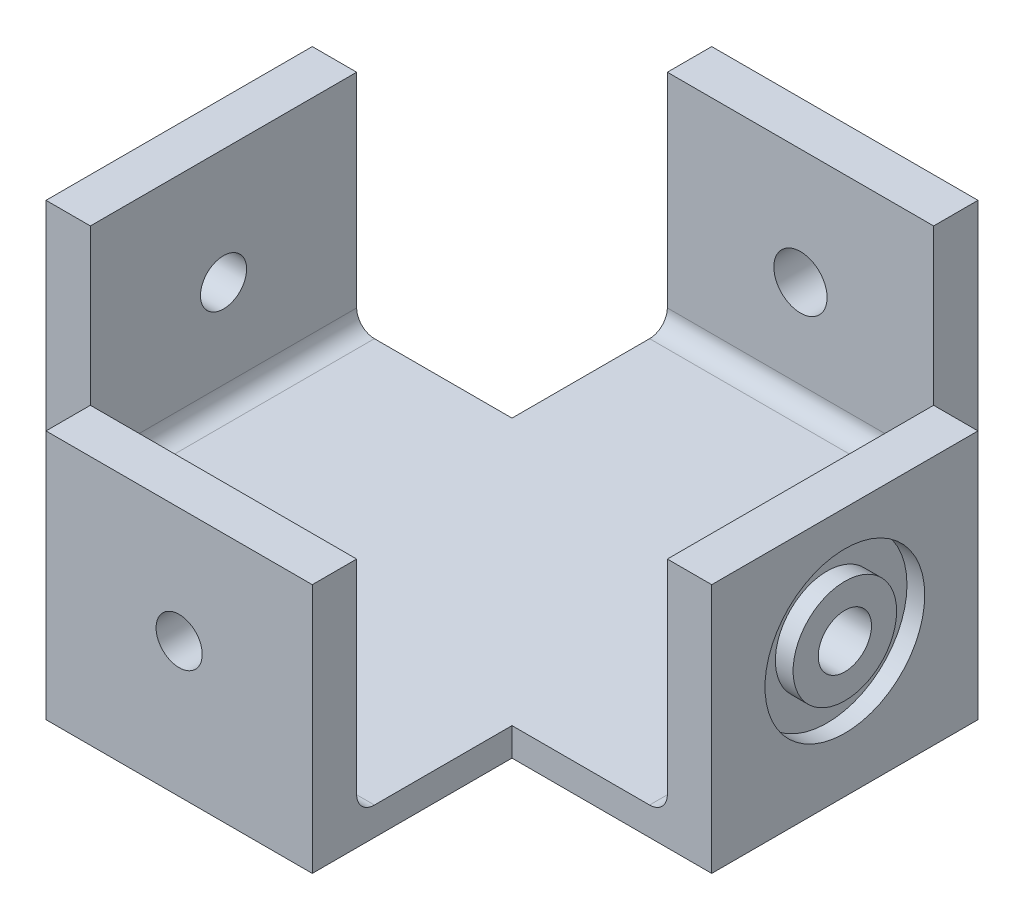
ISO-10303-21;
HEADER;
FILE_DESCRIPTION(('STEP AP214'),'2;1');
FILE_NAME('part.step','',(''),(''),'','','');
FILE_SCHEMA(('AUTOMOTIVE_DESIGN { 1 0 10303 214 1 1 1 1 }'));
ENDSEC;
DATA;
#1=APPLICATION_CONTEXT('core data for automotive mechanical design processes');
#2=APPLICATION_PROTOCOL_DEFINITION('international standard','automotive_design',2000,#1);
#3=PRODUCT_CONTEXT('',#1,'mechanical');
#4=PRODUCT('Part','Part','',(#3));
#5=PRODUCT_RELATED_PRODUCT_CATEGORY('part','',(#4));
#6=PRODUCT_DEFINITION_FORMATION('','',#4);
#7=PRODUCT_DEFINITION_CONTEXT('part definition',#1,'design');
#8=PRODUCT_DEFINITION('design','',#6,#7);
#9=PRODUCT_DEFINITION_SHAPE('','',#8);
#10=(LENGTH_UNIT() NAMED_UNIT(*) SI_UNIT(.MILLI.,.METRE.));
#11=(NAMED_UNIT(*) PLANE_ANGLE_UNIT() SI_UNIT($,.RADIAN.));
#12=(NAMED_UNIT(*) SI_UNIT($,.STERADIAN.) SOLID_ANGLE_UNIT());
#13=UNCERTAINTY_MEASURE_WITH_UNIT(LENGTH_MEASURE(1.E-05),#10,'distance_accuracy_value','');
#14=(GEOMETRIC_REPRESENTATION_CONTEXT(3) GLOBAL_UNCERTAINTY_ASSIGNED_CONTEXT((#13)) GLOBAL_UNIT_ASSIGNED_CONTEXT((#10,
#11,#12)) REPRESENTATION_CONTEXT('',''));
#15=CARTESIAN_POINT('',(0.,0.,0.));
#16=DIRECTION('',(0.,0.,1.));
#17=DIRECTION('',(1.,0.,0.));
#18=AXIS2_PLACEMENT_3D('',#15,#16,#17);
#19=CARTESIAN_POINT('',(37.5,3.175,15.));
#20=DIRECTION('',(-1.,0.,0.));
#21=DIRECTION('',(0.,0.,1.));
#22=AXIS2_PLACEMENT_3D('',#19,#20,#21);
#23=PLANE('',#22);
#24=CARTESIAN_POINT('',(37.5,15.175,0.));
#25=DIRECTION('',(1.,0.,0.));
#26=DIRECTION('',(0.,0.,-1.));
#27=AXIS2_PLACEMENT_3D('',#24,#25,#26);
#28=CIRCLE('',#27,3.);
#29=CARTESIAN_POINT('',(37.5,15.175,-3.));
#30=VERTEX_POINT('',#29);
#31=EDGE_CURVE('E396',#30,#30,#28,.T.);
#32=ORIENTED_EDGE('',*,*,#31,.F.);
#33=EDGE_LOOP('',(#32));
#34=FACE_BOUND('',#33,.T.);
#35=CARTESIAN_POINT('',(37.5,15.175,-5.06264794132254E-13));
#36=DIRECTION('',(1.,0.,0.));
#37=DIRECTION('',(0.,0.,-1.));
#38=AXIS2_PLACEMENT_3D('',#35,#36,#37);
#39=CIRCLE('',#38,5.83);
#40=CARTESIAN_POINT('',(37.4999999999999,15.175,-5.83000000000051));
#41=VERTEX_POINT('',#40);
#42=EDGE_CURVE('E428',#41,#41,#39,.T.);
#43=ORIENTED_EDGE('',*,*,#42,.T.);
#44=EDGE_LOOP('',(#43));
#45=FACE_BOUND('',#44,.T.);
#46=ADVANCED_FACE('F35',(#34,#45),#23,.F.);
#47=CARTESIAN_POINT('',(-15.,3.175,-37.5));
#48=DIRECTION('',(0.,0.,1.));
#49=DIRECTION('',(1.,0.,0.));
#50=AXIS2_PLACEMENT_3D('',#47,#48,#49);
#51=PLANE('',#50);
#52=CARTESIAN_POINT('',(-1.30930550206618E-13,15.175,-37.5));
#53=DIRECTION('',(0.,0.,-1.));
#54=DIRECTION('',(-1.,0.,0.));
#55=AXIS2_PLACEMENT_3D('',#52,#53,#54);
#56=CIRCLE('',#55,3.);
#57=CARTESIAN_POINT('',(-3.00000000000013,15.175,-37.5));
#58=VERTEX_POINT('',#57);
#59=EDGE_CURVE('E405',#58,#58,#56,.T.);
#60=ORIENTED_EDGE('',*,*,#59,.F.);
#61=EDGE_LOOP('',(#60));
#62=FACE_BOUND('',#61,.T.);
#63=CARTESIAN_POINT('',(-1.13473143512402E-13,15.175,-37.5));
#64=DIRECTION('',(0.,0.,-1.));
#65=DIRECTION('',(-1.,0.,0.));
#66=AXIS2_PLACEMENT_3D('',#63,#64,#65);
#67=CIRCLE('',#66,5.83);
#68=CARTESIAN_POINT('',(-5.83000000000011,15.175,-37.5));
#69=VERTEX_POINT('',#68);
#70=EDGE_CURVE('E416',#69,#69,#67,.T.);
#71=ORIENTED_EDGE('',*,*,#70,.T.);
#72=EDGE_LOOP('',(#71));
#73=FACE_BOUND('',#72,.T.);
#74=ADVANCED_FACE('F496',(#62,#73),#51,.F.);
#75=CARTESIAN_POINT('',(0.,3.175,0.));
#76=DIRECTION('',(0.,1.,0.));
#77=DIRECTION('',(0.,0.,1.));
#78=AXIS2_PLACEMENT_3D('',#75,#76,#77);
#79=PLANE('',#78);
#80=DIRECTION('',(0.,0.,1.));
#81=VECTOR('',#80,1.);
#82=CARTESIAN_POINT('',(-15.,3.175,37.5));
#83=LINE('',#82,#81);
#84=CARTESIAN_POINT('',(-15.,3.175,15.));
#85=VERTEX_POINT('',#84);
#86=CARTESIAN_POINT('',(-15.,3.175,30.5));
#87=VERTEX_POINT('',#86);
#88=EDGE_CURVE('E300',#85,#87,#83,.T.);
#89=ORIENTED_EDGE('',*,*,#88,.T.);
#90=DIRECTION('',(-1.,0.,0.));
#91=VECTOR('',#90,1.);
#92=CARTESIAN_POINT('',(0.,3.175,30.5));
#93=LINE('',#92,#91);
#94=CARTESIAN_POINT('',(15.,3.175,30.5));
#95=VERTEX_POINT('',#94);
#96=EDGE_CURVE('E382',#87,#95,#93,.F.);
#97=ORIENTED_EDGE('',*,*,#96,.T.);
#98=DIRECTION('',(0.,0.,-1.));
#99=VECTOR('',#98,1.);
#100=CARTESIAN_POINT('',(15.,3.175,37.5));
#101=LINE('',#100,#99);
#102=CARTESIAN_POINT('',(15.,3.175,15.));
#103=VERTEX_POINT('',#102);
#104=EDGE_CURVE('E303',#95,#103,#101,.T.);
#105=ORIENTED_EDGE('',*,*,#104,.T.);
#106=DIRECTION('',(1.,0.,0.));
#107=VECTOR('',#106,1.);
#108=CARTESIAN_POINT('',(15.,3.175,15.));
#109=LINE('',#108,#107);
#110=CARTESIAN_POINT('',(30.5,3.175,15.));
#111=VERTEX_POINT('',#110);
#112=EDGE_CURVE('E305',#103,#111,#109,.T.);
#113=ORIENTED_EDGE('',*,*,#112,.T.);
#114=DIRECTION('',(0.,0.,1.));
#115=VECTOR('',#114,1.);
#116=CARTESIAN_POINT('',(30.5,3.175,0.));
#117=LINE('',#116,#115);
#118=CARTESIAN_POINT('',(30.5,3.175,-15.));
#119=VERTEX_POINT('',#118);
#120=EDGE_CURVE('E364',#111,#119,#117,.F.);
#121=ORIENTED_EDGE('',*,*,#120,.T.);
#122=DIRECTION('',(-1.,0.,0.));
#123=VECTOR('',#122,1.);
#124=CARTESIAN_POINT('',(15.,3.175,-15.));
#125=LINE('',#124,#123);
#126=CARTESIAN_POINT('',(15.,3.175,-15.));
#127=VERTEX_POINT('',#126);
#128=EDGE_CURVE('E287',#119,#127,#125,.T.);
#129=ORIENTED_EDGE('',*,*,#128,.T.);
#130=DIRECTION('',(0.,0.,-1.));
#131=VECTOR('',#130,1.);
#132=CARTESIAN_POINT('',(15.,3.175,-15.));
#133=LINE('',#132,#131);
#134=CARTESIAN_POINT('',(15.,3.175,-30.5));
#135=VERTEX_POINT('',#134);
#136=EDGE_CURVE('E289',#127,#135,#133,.T.);
#137=ORIENTED_EDGE('',*,*,#136,.T.);
#138=DIRECTION('',(1.,0.,0.));
#139=VECTOR('',#138,1.);
#140=CARTESIAN_POINT('',(0.,3.175,-30.5));
#141=LINE('',#140,#139);
#142=CARTESIAN_POINT('',(-15.,3.175,-30.5));
#143=VERTEX_POINT('',#142);
#144=EDGE_CURVE('E380',#135,#143,#141,.F.);
#145=ORIENTED_EDGE('',*,*,#144,.T.);
#146=DIRECTION('',(0.,0.,1.));
#147=VECTOR('',#146,1.);
#148=CARTESIAN_POINT('',(-15.,3.175,-15.));
#149=LINE('',#148,#147);
#150=CARTESIAN_POINT('',(-15.,3.175,-15.));
#151=VERTEX_POINT('',#150);
#152=EDGE_CURVE('E293',#143,#151,#149,.T.);
#153=ORIENTED_EDGE('',*,*,#152,.T.);
#154=DIRECTION('',(-1.,0.,0.));
#155=VECTOR('',#154,1.);
#156=CARTESIAN_POINT('',(-37.5,3.175,-15.));
#157=LINE('',#156,#155);
#158=CARTESIAN_POINT('',(-30.5,3.175,-15.));
#159=VERTEX_POINT('',#158);
#160=EDGE_CURVE('E295',#151,#159,#157,.T.);
#161=ORIENTED_EDGE('',*,*,#160,.T.);
#162=DIRECTION('',(0.,0.,-1.));
#163=VECTOR('',#162,1.);
#164=CARTESIAN_POINT('',(-30.5,3.175,0.));
#165=LINE('',#164,#163);
#166=CARTESIAN_POINT('',(-30.5,3.175,15.));
#167=VERTEX_POINT('',#166);
#168=EDGE_CURVE('E362',#159,#167,#165,.F.);
#169=ORIENTED_EDGE('',*,*,#168,.T.);
#170=DIRECTION('',(1.,0.,0.));
#171=VECTOR('',#170,1.);
#172=CARTESIAN_POINT('',(-37.5,3.175,15.));
#173=LINE('',#172,#171);
#174=EDGE_CURVE('E298',#167,#85,#173,.T.);
#175=ORIENTED_EDGE('',*,*,#174,.T.);
#176=EDGE_LOOP('',(#89,#97,#105,#113,#121,#129,#137,#145,#153,#161,#169,#175));
#177=FACE_BOUND('',#176,.T.);
#178=ADVANCED_FACE('F501',(#177),#79,.T.);
#179=CARTESIAN_POINT('',(15.,3.175,-15.));
#180=DIRECTION('',(0.,0.,1.));
#181=DIRECTION('',(1.,0.,0.));
#182=AXIS2_PLACEMENT_3D('',#179,#180,#181);
#183=PLANE('',#182);
#184=DIRECTION('',(-1.,0.,0.));
#185=VECTOR('',#184,1.);
#186=CARTESIAN_POINT('',(15.,0.,-15.));
#187=LINE('',#186,#185);
#188=CARTESIAN_POINT('',(37.5,0.,-15.));
#189=VERTEX_POINT('',#188);
#190=CARTESIAN_POINT('',(15.,0.,-15.));
#191=VERTEX_POINT('',#190);
#192=EDGE_CURVE('E286',#189,#191,#187,.T.);
#193=ORIENTED_EDGE('',*,*,#192,.T.);
#194=DIRECTION('',(0.,-1.,0.));
#195=VECTOR('',#194,1.);
#196=CARTESIAN_POINT('',(15.,3.175,-15.));
#197=LINE('',#196,#195);
#198=EDGE_CURVE('E208',#127,#191,#197,.T.);
#199=ORIENTED_EDGE('',*,*,#198,.F.);
#200=ORIENTED_EDGE('',*,*,#128,.F.);
#201=CARTESIAN_POINT('',(30.5,5.175,-15.));
#202=DIRECTION('',(0.,0.,1.));
#203=DIRECTION('',(1.,0.,0.));
#204=AXIS2_PLACEMENT_3D('',#201,#202,#203);
#205=CIRCLE('',#204,2.);
#206=CARTESIAN_POINT('',(32.5,5.175,-15.));
#207=VERTEX_POINT('',#206);
#208=EDGE_CURVE('E371',#119,#207,#205,.T.);
#209=ORIENTED_EDGE('',*,*,#208,.T.);
#210=DIRECTION('',(0.,-1.,0.));
#211=VECTOR('',#210,1.);
#212=CARTESIAN_POINT('',(32.5,28.175,-15.));
#213=LINE('',#212,#211);
#214=CARTESIAN_POINT('',(32.5,28.175,-15.));
#215=VERTEX_POINT('',#214);
#216=EDGE_CURVE('E266',#215,#207,#213,.T.);
#217=ORIENTED_EDGE('',*,*,#216,.F.);
#218=DIRECTION('',(-1.,0.,0.));
#219=VECTOR('',#218,1.);
#220=CARTESIAN_POINT('',(37.5,28.175,-15.));
#221=LINE('',#220,#219);
#222=CARTESIAN_POINT('',(37.5,28.175,-15.));
#223=VERTEX_POINT('',#222);
#224=EDGE_CURVE('E256',#223,#215,#221,.T.);
#225=ORIENTED_EDGE('',*,*,#224,.F.);
#226=DIRECTION('',(0.,-1.,0.));
#227=VECTOR('',#226,1.);
#228=CARTESIAN_POINT('',(37.5,3.175,-15.));
#229=LINE('',#228,#227);
#230=EDGE_CURVE('E308',#223,#189,#229,.T.);
#231=ORIENTED_EDGE('',*,*,#230,.T.);
#232=EDGE_LOOP('',(#193,#199,#200,#209,#217,#225,#231));
#233=FACE_BOUND('',#232,.T.);
#234=ADVANCED_FACE('F463',(#233),#183,.F.);
#235=CARTESIAN_POINT('',(15.,3.175,-15.));
#236=DIRECTION('',(-1.,0.,0.));
#237=DIRECTION('',(0.,0.,1.));
#238=AXIS2_PLACEMENT_3D('',#235,#236,#237);
#239=PLANE('',#238);
#240=DIRECTION('',(0.,0.,-1.));
#241=VECTOR('',#240,1.);
#242=CARTESIAN_POINT('',(15.,0.,-15.));
#243=LINE('',#242,#241);
#244=CARTESIAN_POINT('',(15.,0.,-37.5));
#245=VERTEX_POINT('',#244);
#246=EDGE_CURVE('E205',#191,#245,#243,.T.);
#247=ORIENTED_EDGE('',*,*,#246,.T.);
#248=DIRECTION('',(0.,-1.,0.));
#249=VECTOR('',#248,1.);
#250=CARTESIAN_POINT('',(15.,3.175,-37.5));
#251=LINE('',#250,#249);
#252=CARTESIAN_POINT('',(15.,28.175,-37.5));
#253=VERTEX_POINT('',#252);
#254=EDGE_CURVE('E198',#253,#245,#251,.T.);
#255=ORIENTED_EDGE('',*,*,#254,.F.);
#256=DIRECTION('',(0.,0.,-1.));
#257=VECTOR('',#256,1.);
#258=CARTESIAN_POINT('',(15.,28.175,-37.5));
#259=LINE('',#258,#257);
#260=CARTESIAN_POINT('',(15.,28.175,-32.5));
#261=VERTEX_POINT('',#260);
#262=EDGE_CURVE('E203',#261,#253,#259,.T.);
#263=ORIENTED_EDGE('',*,*,#262,.F.);
#264=DIRECTION('',(0.,-1.,0.));
#265=VECTOR('',#264,1.);
#266=CARTESIAN_POINT('',(15.,28.175,-32.5));
#267=LINE('',#266,#265);
#268=CARTESIAN_POINT('',(15.,5.175,-32.5));
#269=VERTEX_POINT('',#268);
#270=EDGE_CURVE('E233',#261,#269,#267,.T.);
#271=ORIENTED_EDGE('',*,*,#270,.T.);
#272=CARTESIAN_POINT('',(15.,5.175,-30.5));
#273=DIRECTION('',(-1.,0.,0.));
#274=DIRECTION('',(0.,0.,1.));
#275=AXIS2_PLACEMENT_3D('',#272,#273,#274);
#276=CIRCLE('',#275,2.);
#277=EDGE_CURVE('E44',#269,#135,#276,.T.);
#278=ORIENTED_EDGE('',*,*,#277,.T.);
#279=ORIENTED_EDGE('',*,*,#136,.F.);
#280=ORIENTED_EDGE('',*,*,#198,.T.);
#281=EDGE_LOOP('',(#247,#255,#263,#271,#278,#279,#280));
#282=FACE_BOUND('',#281,.T.);
#283=ADVANCED_FACE('F200',(#282),#239,.F.);
#284=CARTESIAN_POINT('',(-1.13473143512402E-13,15.175,-37.5));
#285=DIRECTION('',(0.,0.,-1.));
#286=DIRECTION('',(-1.,0.,0.));
#287=AXIS2_PLACEMENT_3D('',#284,#285,#286);
#288=CIRCLE('',#287,9.);
#289=CARTESIAN_POINT('',(-9.00000000000011,15.175,-37.5));
#290=VERTEX_POINT('',#289);
#291=EDGE_CURVE('E410',#290,#290,#288,.T.);
#292=ORIENTED_EDGE('',*,*,#291,.F.);
#293=EDGE_LOOP('',(#292));
#294=FACE_BOUND('',#293,.T.);
#295=DIRECTION('',(-1.,0.,0.));
#296=VECTOR('',#295,1.);
#297=CARTESIAN_POINT('',(-15.,0.,-37.5));
#298=LINE('',#297,#296);
#299=CARTESIAN_POINT('',(-15.,0.,-37.5));
#300=VERTEX_POINT('',#299);
#301=EDGE_CURVE('E312',#245,#300,#298,.T.);
#302=ORIENTED_EDGE('',*,*,#301,.T.);
#303=DIRECTION('',(0.,-1.,0.));
#304=VECTOR('',#303,1.);
#305=CARTESIAN_POINT('',(-15.,3.175,-37.5));
#306=LINE('',#305,#304);
#307=CARTESIAN_POINT('',(-15.,28.175,-37.5));
#308=VERTEX_POINT('',#307);
#309=EDGE_CURVE('E209',#308,#300,#306,.T.);
#310=ORIENTED_EDGE('',*,*,#309,.F.);
#311=DIRECTION('',(-1.,0.,0.));
#312=VECTOR('',#311,1.);
#313=CARTESIAN_POINT('',(15.,28.175,-37.5));
#314=LINE('',#313,#312);
#315=EDGE_CURVE('E212',#253,#308,#314,.T.);
#316=ORIENTED_EDGE('',*,*,#315,.F.);
#317=ORIENTED_EDGE('',*,*,#254,.T.);
#318=EDGE_LOOP('',(#302,#310,#316,#317));
#319=FACE_BOUND('',#318,.T.);
#320=ADVANCED_FACE('F213',(#294,#319),#51,.F.);
#321=CARTESIAN_POINT('',(-15.,3.175,-15.));
#322=DIRECTION('',(1.,0.,0.));
#323=DIRECTION('',(0.,0.,-1.));
#324=AXIS2_PLACEMENT_3D('',#321,#322,#323);
#325=PLANE('',#324);
#326=DIRECTION('',(0.,0.,1.));
#327=VECTOR('',#326,1.);
#328=CARTESIAN_POINT('',(-15.,0.,-15.));
#329=LINE('',#328,#327);
#330=CARTESIAN_POINT('',(-15.,0.,-15.));
#331=VERTEX_POINT('',#330);
#332=EDGE_CURVE('E314',#300,#331,#329,.T.);
#333=ORIENTED_EDGE('',*,*,#332,.T.);
#334=DIRECTION('',(0.,-1.,0.));
#335=VECTOR('',#334,1.);
#336=CARTESIAN_POINT('',(-15.,3.175,-15.));
#337=LINE('',#336,#335);
#338=EDGE_CURVE('E354',#151,#331,#337,.T.);
#339=ORIENTED_EDGE('',*,*,#338,.F.);
#340=ORIENTED_EDGE('',*,*,#152,.F.);
#341=CARTESIAN_POINT('',(-15.,5.175,-30.5));
#342=DIRECTION('',(1.,0.,0.));
#343=DIRECTION('',(0.,0.,-1.));
#344=AXIS2_PLACEMENT_3D('',#341,#342,#343);
#345=CIRCLE('',#344,2.);
#346=CARTESIAN_POINT('',(-15.,5.175,-32.5));
#347=VERTEX_POINT('',#346);
#348=EDGE_CURVE('E11',#143,#347,#345,.T.);
#349=ORIENTED_EDGE('',*,*,#348,.T.);
#350=DIRECTION('',(0.,-1.,0.));
#351=VECTOR('',#350,1.);
#352=CARTESIAN_POINT('',(-15.,28.175,-32.5));
#353=LINE('',#352,#351);
#354=CARTESIAN_POINT('',(-15.,28.175,-32.5));
#355=VERTEX_POINT('',#354);
#356=EDGE_CURVE('E235',#355,#347,#353,.T.);
#357=ORIENTED_EDGE('',*,*,#356,.F.);
#358=DIRECTION('',(0.,0.,1.));
#359=VECTOR('',#358,1.);
#360=CARTESIAN_POINT('',(-15.,28.175,-37.5));
#361=LINE('',#360,#359);
#362=EDGE_CURVE('E217',#308,#355,#361,.T.);
#363=ORIENTED_EDGE('',*,*,#362,.F.);
#364=ORIENTED_EDGE('',*,*,#309,.T.);
#365=EDGE_LOOP('',(#333,#339,#340,#349,#357,#363,#364));
#366=FACE_BOUND('',#365,.T.);
#367=ADVANCED_FACE('F533',(#366),#325,.F.);
#368=CARTESIAN_POINT('',(-37.5,3.175,-15.));
#369=DIRECTION('',(0.,0.,1.));
#370=DIRECTION('',(1.,0.,0.));
#371=AXIS2_PLACEMENT_3D('',#368,#369,#370);
#372=PLANE('',#371);
#373=DIRECTION('',(-1.,0.,0.));
#374=VECTOR('',#373,1.);
#375=CARTESIAN_POINT('',(-37.5,0.,-15.));
#376=LINE('',#375,#374);
#377=CARTESIAN_POINT('',(-37.5,0.,-15.));
#378=VERTEX_POINT('',#377);
#379=EDGE_CURVE('E316',#331,#378,#376,.T.);
#380=ORIENTED_EDGE('',*,*,#379,.T.);
#381=DIRECTION('',(0.,-1.,0.));
#382=VECTOR('',#381,1.);
#383=CARTESIAN_POINT('',(-37.5,3.175,-15.));
#384=LINE('',#383,#382);
#385=CARTESIAN_POINT('',(-37.5,28.175,-15.));
#386=VERTEX_POINT('',#385);
#387=EDGE_CURVE('E351',#386,#378,#384,.T.);
#388=ORIENTED_EDGE('',*,*,#387,.F.);
#389=DIRECTION('',(-1.,0.,0.));
#390=VECTOR('',#389,1.);
#391=CARTESIAN_POINT('',(-37.5,28.175,-15.));
#392=LINE('',#391,#390);
#393=CARTESIAN_POINT('',(-32.5,28.175,-15.));
#394=VERTEX_POINT('',#393);
#395=EDGE_CURVE('E272',#394,#386,#392,.T.);
#396=ORIENTED_EDGE('',*,*,#395,.F.);
#397=DIRECTION('',(0.,-1.,0.));
#398=VECTOR('',#397,1.);
#399=CARTESIAN_POINT('',(-32.5,28.175,-15.));
#400=LINE('',#399,#398);
#401=CARTESIAN_POINT('',(-32.5,5.175,-15.));
#402=VERTEX_POINT('',#401);
#403=EDGE_CURVE('E283',#394,#402,#400,.T.);
#404=ORIENTED_EDGE('',*,*,#403,.T.);
#405=CARTESIAN_POINT('',(-30.5,5.175,-15.));
#406=DIRECTION('',(0.,0.,1.));
#407=DIRECTION('',(1.,0.,0.));
#408=AXIS2_PLACEMENT_3D('',#405,#406,#407);
#409=CIRCLE('',#408,2.);
#410=EDGE_CURVE('E373',#402,#159,#409,.T.);
#411=ORIENTED_EDGE('',*,*,#410,.T.);
#412=ORIENTED_EDGE('',*,*,#160,.F.);
#413=ORIENTED_EDGE('',*,*,#338,.T.);
#414=EDGE_LOOP('',(#380,#388,#396,#404,#411,#412,#413));
#415=FACE_BOUND('',#414,.T.);
#416=ADVANCED_FACE('F529',(#415),#372,.F.);
#417=CARTESIAN_POINT('',(-37.5,3.175,15.));
#418=DIRECTION('',(1.,0.,0.));
#419=DIRECTION('',(0.,0.,-1.));
#420=AXIS2_PLACEMENT_3D('',#417,#418,#419);
#421=PLANE('',#420);
#422=CARTESIAN_POINT('',(-37.5,15.175,0.));
#423=DIRECTION('',(-1.,0.,0.));
#424=DIRECTION('',(0.,0.,1.));
#425=AXIS2_PLACEMENT_3D('',#422,#423,#424);
#426=CIRCLE('',#425,2.6);
#427=CARTESIAN_POINT('',(-37.5,15.175,2.6));
#428=VERTEX_POINT('',#427);
#429=EDGE_CURVE('E226',#428,#428,#426,.T.);
#430=ORIENTED_EDGE('',*,*,#429,.F.);
#431=EDGE_LOOP('',(#430));
#432=FACE_BOUND('',#431,.T.);
#433=DIRECTION('',(0.,0.,1.));
#434=VECTOR('',#433,1.);
#435=CARTESIAN_POINT('',(-37.5,0.,15.));
#436=LINE('',#435,#434);
#437=CARTESIAN_POINT('',(-37.5,0.,15.));
#438=VERTEX_POINT('',#437);
#439=EDGE_CURVE('E318',#378,#438,#436,.T.);
#440=ORIENTED_EDGE('',*,*,#439,.T.);
#441=DIRECTION('',(0.,-1.,0.));
#442=VECTOR('',#441,1.);
#443=CARTESIAN_POINT('',(-37.5,3.175,15.));
#444=LINE('',#443,#442);
#445=CARTESIAN_POINT('',(-37.5,28.175,15.));
#446=VERTEX_POINT('',#445);
#447=EDGE_CURVE('E348',#446,#438,#444,.T.);
#448=ORIENTED_EDGE('',*,*,#447,.F.);
#449=DIRECTION('',(0.,0.,1.));
#450=VECTOR('',#449,1.);
#451=CARTESIAN_POINT('',(-37.5,28.175,15.));
#452=LINE('',#451,#450);
#453=EDGE_CURVE('E275',#386,#446,#452,.T.);
#454=ORIENTED_EDGE('',*,*,#453,.F.);
#455=ORIENTED_EDGE('',*,*,#387,.T.);
#456=EDGE_LOOP('',(#440,#448,#454,#455));
#457=FACE_BOUND('',#456,.T.);
#458=ADVANCED_FACE('F525',(#432,#457),#421,.F.);
#459=CARTESIAN_POINT('',(-37.5,3.175,15.));
#460=DIRECTION('',(0.,0.,-1.));
#461=DIRECTION('',(-1.,0.,0.));
#462=AXIS2_PLACEMENT_3D('',#459,#460,#461);
#463=PLANE('',#462);
#464=DIRECTION('',(1.,0.,0.));
#465=VECTOR('',#464,1.);
#466=CARTESIAN_POINT('',(-37.5,0.,15.));
#467=LINE('',#466,#465);
#468=CARTESIAN_POINT('',(-15.,0.,15.));
#469=VERTEX_POINT('',#468);
#470=EDGE_CURVE('E320',#438,#469,#467,.T.);
#471=ORIENTED_EDGE('',*,*,#470,.T.);
#472=DIRECTION('',(0.,-1.,0.));
#473=VECTOR('',#472,1.);
#474=CARTESIAN_POINT('',(-15.,3.175,15.));
#475=LINE('',#474,#473);
#476=EDGE_CURVE('E345',#85,#469,#475,.T.);
#477=ORIENTED_EDGE('',*,*,#476,.F.);
#478=ORIENTED_EDGE('',*,*,#174,.F.);
#479=CARTESIAN_POINT('',(-30.5,5.175,15.));
#480=DIRECTION('',(0.,0.,-1.));
#481=DIRECTION('',(-1.,0.,0.));
#482=AXIS2_PLACEMENT_3D('',#479,#480,#481);
#483=CIRCLE('',#482,2.);
#484=CARTESIAN_POINT('',(-32.5,5.175,15.));
#485=VERTEX_POINT('',#484);
#486=EDGE_CURVE('E375',#167,#485,#483,.T.);
#487=ORIENTED_EDGE('',*,*,#486,.T.);
#488=DIRECTION('',(0.,-1.,0.));
#489=VECTOR('',#488,1.);
#490=CARTESIAN_POINT('',(-32.5,28.175,15.));
#491=LINE('',#490,#489);
#492=CARTESIAN_POINT('',(-32.5,28.175,15.));
#493=VERTEX_POINT('',#492);
#494=EDGE_CURVE('E280',#493,#485,#491,.T.);
#495=ORIENTED_EDGE('',*,*,#494,.F.);
#496=DIRECTION('',(1.,0.,0.));
#497=VECTOR('',#496,1.);
#498=CARTESIAN_POINT('',(-37.5,28.175,15.));
#499=LINE('',#498,#497);
#500=EDGE_CURVE('E278',#446,#493,#499,.T.);
#501=ORIENTED_EDGE('',*,*,#500,.F.);
#502=ORIENTED_EDGE('',*,*,#447,.T.);
#503=EDGE_LOOP('',(#471,#477,#478,#487,#495,#501,#502));
#504=FACE_BOUND('',#503,.T.);
#505=ADVANCED_FACE('F521',(#504),#463,.F.);
#506=CARTESIAN_POINT('',(-15.,3.175,37.5));
#507=DIRECTION('',(1.,0.,0.));
#508=DIRECTION('',(0.,0.,-1.));
#509=AXIS2_PLACEMENT_3D('',#506,#507,#508);
#510=PLANE('',#509);
#511=DIRECTION('',(0.,0.,1.));
#512=VECTOR('',#511,1.);
#513=CARTESIAN_POINT('',(-15.,0.,37.5));
#514=LINE('',#513,#512);
#515=CARTESIAN_POINT('',(-15.,0.,37.5));
#516=VERTEX_POINT('',#515);
#517=EDGE_CURVE('E322',#469,#516,#514,.T.);
#518=ORIENTED_EDGE('',*,*,#517,.T.);
#519=DIRECTION('',(0.,-1.,0.));
#520=VECTOR('',#519,1.);
#521=CARTESIAN_POINT('',(-15.,3.175,37.5));
#522=LINE('',#521,#520);
#523=CARTESIAN_POINT('',(-15.,28.175,37.5));
#524=VERTEX_POINT('',#523);
#525=EDGE_CURVE('E342',#524,#516,#522,.T.);
#526=ORIENTED_EDGE('',*,*,#525,.F.);
#527=DIRECTION('',(0.,0.,1.));
#528=VECTOR('',#527,1.);
#529=CARTESIAN_POINT('',(-15.,28.175,37.5));
#530=LINE('',#529,#528);
#531=CARTESIAN_POINT('',(-15.,28.175,32.5));
#532=VERTEX_POINT('',#531);
#533=EDGE_CURVE('E237',#532,#524,#530,.T.);
#534=ORIENTED_EDGE('',*,*,#533,.F.);
#535=DIRECTION('',(0.,-1.,0.));
#536=VECTOR('',#535,1.);
#537=CARTESIAN_POINT('',(-15.,28.175,32.5));
#538=LINE('',#537,#536);
#539=CARTESIAN_POINT('',(-15.,5.175,32.5));
#540=VERTEX_POINT('',#539);
#541=EDGE_CURVE('E247',#532,#540,#538,.T.);
#542=ORIENTED_EDGE('',*,*,#541,.T.);
#543=CARTESIAN_POINT('',(-15.,5.175,30.5));
#544=DIRECTION('',(1.,0.,0.));
#545=DIRECTION('',(0.,0.,-1.));
#546=AXIS2_PLACEMENT_3D('',#543,#544,#545);
#547=CIRCLE('',#546,2.);
#548=EDGE_CURVE('E386',#540,#87,#547,.T.);
#549=ORIENTED_EDGE('',*,*,#548,.T.);
#550=ORIENTED_EDGE('',*,*,#88,.F.);
#551=ORIENTED_EDGE('',*,*,#476,.T.);
#552=EDGE_LOOP('',(#518,#526,#534,#542,#549,#550,#551));
#553=FACE_BOUND('',#552,.T.);
#554=ADVANCED_FACE('F517',(#553),#510,.F.);
#555=CARTESIAN_POINT('',(-15.,3.175,37.5));
#556=DIRECTION('',(0.,0.,-1.));
#557=DIRECTION('',(-1.,0.,0.));
#558=AXIS2_PLACEMENT_3D('',#555,#556,#557);
#559=PLANE('',#558);
#560=CARTESIAN_POINT('',(1.30930550206617E-13,15.175,37.5));
#561=DIRECTION('',(0.,0.,1.));
#562=DIRECTION('',(1.,0.,0.));
#563=AXIS2_PLACEMENT_3D('',#560,#561,#562);
#564=CIRCLE('',#563,2.6);
#565=CARTESIAN_POINT('',(2.60000000000013,15.175,37.5));
#566=VERTEX_POINT('',#565);
#567=EDGE_CURVE('E393',#566,#566,#564,.T.);
#568=ORIENTED_EDGE('',*,*,#567,.F.);
#569=EDGE_LOOP('',(#568));
#570=FACE_BOUND('',#569,.T.);
#571=DIRECTION('',(1.,0.,0.));
#572=VECTOR('',#571,1.);
#573=CARTESIAN_POINT('',(-15.,0.,37.5));
#574=LINE('',#573,#572);
#575=CARTESIAN_POINT('',(15.,0.,37.5));
#576=VERTEX_POINT('',#575);
#577=EDGE_CURVE('E324',#516,#576,#574,.T.);
#578=ORIENTED_EDGE('',*,*,#577,.T.);
#579=DIRECTION('',(0.,-1.,0.));
#580=VECTOR('',#579,1.);
#581=CARTESIAN_POINT('',(15.,3.175,37.5));
#582=LINE('',#581,#580);
#583=CARTESIAN_POINT('',(15.,28.175,37.5));
#584=VERTEX_POINT('',#583);
#585=EDGE_CURVE('E339',#584,#576,#582,.T.);
#586=ORIENTED_EDGE('',*,*,#585,.F.);
#587=DIRECTION('',(1.,0.,0.));
#588=VECTOR('',#587,1.);
#589=CARTESIAN_POINT('',(15.,28.175,37.5));
#590=LINE('',#589,#588);
#591=EDGE_CURVE('E240',#524,#584,#590,.T.);
#592=ORIENTED_EDGE('',*,*,#591,.F.);
#593=ORIENTED_EDGE('',*,*,#525,.T.);
#594=EDGE_LOOP('',(#578,#586,#592,#593));
#595=FACE_BOUND('',#594,.T.);
#596=ADVANCED_FACE('F513',(#570,#595),#559,.F.);
#597=CARTESIAN_POINT('',(15.,3.175,37.5));
#598=DIRECTION('',(-1.,0.,0.));
#599=DIRECTION('',(0.,0.,1.));
#600=AXIS2_PLACEMENT_3D('',#597,#598,#599);
#601=PLANE('',#600);
#602=DIRECTION('',(0.,0.,-1.));
#603=VECTOR('',#602,1.);
#604=CARTESIAN_POINT('',(15.,0.,37.5));
#605=LINE('',#604,#603);
#606=CARTESIAN_POINT('',(15.,0.,15.));
#607=VERTEX_POINT('',#606);
#608=EDGE_CURVE('E326',#576,#607,#605,.T.);
#609=ORIENTED_EDGE('',*,*,#608,.T.);
#610=DIRECTION('',(0.,-1.,0.));
#611=VECTOR('',#610,1.);
#612=CARTESIAN_POINT('',(15.,3.175,15.));
#613=LINE('',#612,#611);
#614=EDGE_CURVE('E336',#103,#607,#613,.T.);
#615=ORIENTED_EDGE('',*,*,#614,.F.);
#616=ORIENTED_EDGE('',*,*,#104,.F.);
#617=CARTESIAN_POINT('',(15.,5.175,30.5));
#618=DIRECTION('',(-1.,0.,0.));
#619=DIRECTION('',(0.,0.,1.));
#620=AXIS2_PLACEMENT_3D('',#617,#618,#619);
#621=CIRCLE('',#620,2.);
#622=CARTESIAN_POINT('',(15.,5.175,32.5));
#623=VERTEX_POINT('',#622);
#624=EDGE_CURVE('E388',#95,#623,#621,.T.);
#625=ORIENTED_EDGE('',*,*,#624,.T.);
#626=DIRECTION('',(0.,-1.,0.));
#627=VECTOR('',#626,1.);
#628=CARTESIAN_POINT('',(15.,28.175,32.5));
#629=LINE('',#628,#627);
#630=CARTESIAN_POINT('',(15.,28.175,32.5));
#631=VERTEX_POINT('',#630);
#632=EDGE_CURVE('E250',#631,#623,#629,.T.);
#633=ORIENTED_EDGE('',*,*,#632,.F.);
#634=DIRECTION('',(0.,0.,-1.));
#635=VECTOR('',#634,1.);
#636=CARTESIAN_POINT('',(15.,28.175,37.5));
#637=LINE('',#636,#635);
#638=EDGE_CURVE('E243',#584,#631,#637,.T.);
#639=ORIENTED_EDGE('',*,*,#638,.F.);
#640=ORIENTED_EDGE('',*,*,#585,.T.);
#641=EDGE_LOOP('',(#609,#615,#616,#625,#633,#639,#640));
#642=FACE_BOUND('',#641,.T.);
#643=ADVANCED_FACE('F510',(#642),#601,.F.);
#644=CARTESIAN_POINT('',(15.,3.175,15.));
#645=DIRECTION('',(0.,0.,-1.));
#646=DIRECTION('',(-1.,0.,0.));
#647=AXIS2_PLACEMENT_3D('',#644,#645,#646);
#648=PLANE('',#647);
#649=DIRECTION('',(1.,0.,0.));
#650=VECTOR('',#649,1.);
#651=CARTESIAN_POINT('',(15.,0.,15.));
#652=LINE('',#651,#650);
#653=CARTESIAN_POINT('',(37.5,0.,15.));
#654=VERTEX_POINT('',#653);
#655=EDGE_CURVE('E328',#607,#654,#652,.T.);
#656=ORIENTED_EDGE('',*,*,#655,.T.);
#657=DIRECTION('',(0.,-1.,0.));
#658=VECTOR('',#657,1.);
#659=CARTESIAN_POINT('',(37.5,3.175,15.));
#660=LINE('',#659,#658);
#661=CARTESIAN_POINT('',(37.5,28.175,15.));
#662=VERTEX_POINT('',#661);
#663=EDGE_CURVE('E333',#662,#654,#660,.T.);
#664=ORIENTED_EDGE('',*,*,#663,.F.);
#665=DIRECTION('',(1.,0.,0.));
#666=VECTOR('',#665,1.);
#667=CARTESIAN_POINT('',(37.5,28.175,15.));
#668=LINE('',#667,#666);
#669=CARTESIAN_POINT('',(32.5,28.175,15.));
#670=VERTEX_POINT('',#669);
#671=EDGE_CURVE('E260',#670,#662,#668,.T.);
#672=ORIENTED_EDGE('',*,*,#671,.F.);
#673=DIRECTION('',(0.,-1.,0.));
#674=VECTOR('',#673,1.);
#675=CARTESIAN_POINT('',(32.5,28.175,15.));
#676=LINE('',#675,#674);
#677=CARTESIAN_POINT('',(32.5,5.175,15.));
#678=VERTEX_POINT('',#677);
#679=EDGE_CURVE('E263',#670,#678,#676,.T.);
#680=ORIENTED_EDGE('',*,*,#679,.T.);
#681=CARTESIAN_POINT('',(30.5,5.175,15.));
#682=DIRECTION('',(0.,0.,-1.));
#683=DIRECTION('',(-1.,0.,0.));
#684=AXIS2_PLACEMENT_3D('',#681,#682,#683);
#685=CIRCLE('',#684,2.);
#686=EDGE_CURVE('E369',#678,#111,#685,.T.);
#687=ORIENTED_EDGE('',*,*,#686,.T.);
#688=ORIENTED_EDGE('',*,*,#112,.F.);
#689=ORIENTED_EDGE('',*,*,#614,.T.);
#690=EDGE_LOOP('',(#656,#664,#672,#680,#687,#688,#689));
#691=FACE_BOUND('',#690,.T.);
#692=ADVANCED_FACE('F454',(#691),#648,.F.);
#693=CARTESIAN_POINT('',(37.5,15.175,-5.06264794132254E-13));
#694=DIRECTION('',(1.,0.,0.));
#695=DIRECTION('',(0.,0.,-1.));
#696=AXIS2_PLACEMENT_3D('',#693,#694,#695);
#697=CIRCLE('',#696,9.);
#698=CARTESIAN_POINT('',(37.4999999999999,15.175,-9.00000000000051));
#699=VERTEX_POINT('',#698);
#700=EDGE_CURVE('E422',#699,#699,#697,.T.);
#701=ORIENTED_EDGE('',*,*,#700,.F.);
#702=EDGE_LOOP('',(#701));
#703=FACE_BOUND('',#702,.T.);
#704=DIRECTION('',(0.,0.,-1.));
#705=VECTOR('',#704,1.);
#706=CARTESIAN_POINT('',(37.5,0.,15.));
#707=LINE('',#706,#705);
#708=EDGE_CURVE('E290',#654,#189,#707,.T.);
#709=ORIENTED_EDGE('',*,*,#708,.T.);
#710=ORIENTED_EDGE('',*,*,#230,.F.);
#711=DIRECTION('',(0.,0.,-1.));
#712=VECTOR('',#711,1.);
#713=CARTESIAN_POINT('',(37.5,28.175,15.));
#714=LINE('',#713,#712);
#715=EDGE_CURVE('E253',#662,#223,#714,.T.);
#716=ORIENTED_EDGE('',*,*,#715,.F.);
#717=ORIENTED_EDGE('',*,*,#663,.T.);
#718=EDGE_LOOP('',(#709,#710,#716,#717));
#719=FACE_BOUND('',#718,.T.);
#720=ADVANCED_FACE('F450',(#703,#719),#23,.F.);
#721=CARTESIAN_POINT('',(0.,0.,0.));
#722=DIRECTION('',(0.,1.,0.));
#723=DIRECTION('',(0.,0.,1.));
#724=AXIS2_PLACEMENT_3D('',#721,#722,#723);
#725=PLANE('',#724);
#726=ORIENTED_EDGE('',*,*,#192,.F.);
#727=ORIENTED_EDGE('',*,*,#708,.F.);
#728=ORIENTED_EDGE('',*,*,#655,.F.);
#729=ORIENTED_EDGE('',*,*,#608,.F.);
#730=ORIENTED_EDGE('',*,*,#577,.F.);
#731=ORIENTED_EDGE('',*,*,#517,.F.);
#732=ORIENTED_EDGE('',*,*,#470,.F.);
#733=ORIENTED_EDGE('',*,*,#439,.F.);
#734=ORIENTED_EDGE('',*,*,#379,.F.);
#735=ORIENTED_EDGE('',*,*,#332,.F.);
#736=ORIENTED_EDGE('',*,*,#301,.F.);
#737=ORIENTED_EDGE('',*,*,#246,.F.);
#738=EDGE_LOOP('',(#726,#727,#728,#729,#730,#731,#732,#733,#734,#735,#736,#737));
#739=FACE_BOUND('',#738,.T.);
#740=ADVANCED_FACE('F453',(#739),#725,.F.);
#741=CARTESIAN_POINT('',(-32.5,28.175,15.));
#742=DIRECTION('',(-1.,0.,0.));
#743=DIRECTION('',(0.,0.,1.));
#744=AXIS2_PLACEMENT_3D('',#741,#742,#743);
#745=PLANE('',#744);
#746=CARTESIAN_POINT('',(-32.5,15.175,0.));
#747=DIRECTION('',(-1.,0.,0.));
#748=DIRECTION('',(0.,0.,1.));
#749=AXIS2_PLACEMENT_3D('',#746,#747,#748);
#750=CIRCLE('',#749,2.6);
#751=CARTESIAN_POINT('',(-32.5,15.175,2.6));
#752=VERTEX_POINT('',#751);
#753=EDGE_CURVE('E223',#752,#752,#750,.T.);
#754=ORIENTED_EDGE('',*,*,#753,.T.);
#755=EDGE_LOOP('',(#754));
#756=FACE_BOUND('',#755,.T.);
#757=ORIENTED_EDGE('',*,*,#494,.T.);
#758=DIRECTION('',(0.,0.,-1.));
#759=VECTOR('',#758,1.);
#760=CARTESIAN_POINT('',(-32.5,5.175,15.));
#761=LINE('',#760,#759);
#762=EDGE_CURVE('E366',#485,#402,#761,.T.);
#763=ORIENTED_EDGE('',*,*,#762,.T.);
#764=ORIENTED_EDGE('',*,*,#403,.F.);
#765=DIRECTION('',(0.,0.,-1.));
#766=VECTOR('',#765,1.);
#767=CARTESIAN_POINT('',(-32.5,28.175,15.));
#768=LINE('',#767,#766);
#769=EDGE_CURVE('E269',#493,#394,#768,.T.);
#770=ORIENTED_EDGE('',*,*,#769,.F.);
#771=EDGE_LOOP('',(#757,#763,#764,#770));
#772=FACE_BOUND('',#771,.T.);
#773=ADVANCED_FACE('F594',(#756,#772),#745,.F.);
#774=CARTESIAN_POINT('',(0.,28.175,0.));
#775=DIRECTION('',(0.,-1.,0.));
#776=DIRECTION('',(0.,0.,-1.));
#777=AXIS2_PLACEMENT_3D('',#774,#775,#776);
#778=PLANE('',#777);
#779=ORIENTED_EDGE('',*,*,#769,.T.);
#780=ORIENTED_EDGE('',*,*,#395,.T.);
#781=ORIENTED_EDGE('',*,*,#453,.T.);
#782=ORIENTED_EDGE('',*,*,#500,.T.);
#783=EDGE_LOOP('',(#779,#780,#781,#782));
#784=FACE_BOUND('',#783,.T.);
#785=ADVANCED_FACE('F492',(#784),#778,.F.);
#786=CARTESIAN_POINT('',(32.5,28.175,15.));
#787=DIRECTION('',(1.,0.,0.));
#788=DIRECTION('',(0.,0.,-1.));
#789=AXIS2_PLACEMENT_3D('',#786,#787,#788);
#790=PLANE('',#789);
#791=CARTESIAN_POINT('',(32.5,15.175,0.));
#792=DIRECTION('',(1.,0.,0.));
#793=DIRECTION('',(0.,0.,-1.));
#794=AXIS2_PLACEMENT_3D('',#791,#792,#793);
#795=CIRCLE('',#794,3.);
#796=CARTESIAN_POINT('',(32.5,15.175,-3.));
#797=VERTEX_POINT('',#796);
#798=EDGE_CURVE('E394',#797,#797,#795,.T.);
#799=ORIENTED_EDGE('',*,*,#798,.T.);
#800=EDGE_LOOP('',(#799));
#801=FACE_BOUND('',#800,.T.);
#802=ORIENTED_EDGE('',*,*,#216,.T.);
#803=DIRECTION('',(0.,0.,1.));
#804=VECTOR('',#803,1.);
#805=CARTESIAN_POINT('',(32.5,5.175,15.));
#806=LINE('',#805,#804);
#807=EDGE_CURVE('E359',#207,#678,#806,.T.);
#808=ORIENTED_EDGE('',*,*,#807,.T.);
#809=ORIENTED_EDGE('',*,*,#679,.F.);
#810=DIRECTION('',(0.,0.,1.));
#811=VECTOR('',#810,1.);
#812=CARTESIAN_POINT('',(32.5,28.175,15.));
#813=LINE('',#812,#811);
#814=EDGE_CURVE('E258',#215,#670,#813,.T.);
#815=ORIENTED_EDGE('',*,*,#814,.F.);
#816=EDGE_LOOP('',(#802,#808,#809,#815));
#817=FACE_BOUND('',#816,.T.);
#818=ADVANCED_FACE('F477',(#801,#817),#790,.F.);
#819=CARTESIAN_POINT('',(0.,28.175,0.));
#820=DIRECTION('',(0.,1.,0.));
#821=DIRECTION('',(0.,0.,1.));
#822=AXIS2_PLACEMENT_3D('',#819,#820,#821);
#823=PLANE('',#822);
#824=ORIENTED_EDGE('',*,*,#715,.T.);
#825=ORIENTED_EDGE('',*,*,#224,.T.);
#826=ORIENTED_EDGE('',*,*,#814,.T.);
#827=ORIENTED_EDGE('',*,*,#671,.T.);
#828=EDGE_LOOP('',(#824,#825,#826,#827));
#829=FACE_BOUND('',#828,.T.);
#830=ADVANCED_FACE('F483',(#829),#823,.T.);
#831=CARTESIAN_POINT('',(30.5,5.175,15.));
#832=DIRECTION('',(0.,0.,1.));
#833=DIRECTION('',(1.,0.,0.));
#834=AXIS2_PLACEMENT_3D('',#831,#832,#833);
#835=CYLINDRICAL_SURFACE('',#834,2.);
#836=ORIENTED_EDGE('',*,*,#208,.F.);
#837=ORIENTED_EDGE('',*,*,#120,.F.);
#838=ORIENTED_EDGE('',*,*,#686,.F.);
#839=ORIENTED_EDGE('',*,*,#807,.F.);
#840=EDGE_LOOP('',(#836,#837,#838,#839));
#841=FACE_BOUND('',#840,.T.);
#842=ADVANCED_FACE('F474',(#841),#835,.F.);
#843=CARTESIAN_POINT('',(-30.5,5.175,15.));
#844=DIRECTION('',(0.,0.,-1.));
#845=DIRECTION('',(-1.,0.,0.));
#846=AXIS2_PLACEMENT_3D('',#843,#844,#845);
#847=CYLINDRICAL_SURFACE('',#846,2.);
#848=ORIENTED_EDGE('',*,*,#486,.F.);
#849=ORIENTED_EDGE('',*,*,#168,.F.);
#850=ORIENTED_EDGE('',*,*,#410,.F.);
#851=ORIENTED_EDGE('',*,*,#762,.F.);
#852=EDGE_LOOP('',(#848,#849,#850,#851));
#853=FACE_BOUND('',#852,.T.);
#854=ADVANCED_FACE('F490',(#853),#847,.F.);
#855=CARTESIAN_POINT('',(15.,28.175,32.5));
#856=DIRECTION('',(0.,0.,1.));
#857=DIRECTION('',(1.,0.,0.));
#858=AXIS2_PLACEMENT_3D('',#855,#856,#857);
#859=PLANE('',#858);
#860=CARTESIAN_POINT('',(1.13473143512402E-13,15.175,32.5));
#861=DIRECTION('',(0.,0.,1.));
#862=DIRECTION('',(1.,0.,0.));
#863=AXIS2_PLACEMENT_3D('',#860,#861,#862);
#864=CIRCLE('',#863,2.6);
#865=CARTESIAN_POINT('',(2.60000000000011,15.175,32.5));
#866=VERTEX_POINT('',#865);
#867=EDGE_CURVE('E391',#866,#866,#864,.T.);
#868=ORIENTED_EDGE('',*,*,#867,.T.);
#869=EDGE_LOOP('',(#868));
#870=FACE_BOUND('',#869,.T.);
#871=ORIENTED_EDGE('',*,*,#632,.T.);
#872=DIRECTION('',(-1.,0.,0.));
#873=VECTOR('',#872,1.);
#874=CARTESIAN_POINT('',(15.,5.175,32.5));
#875=LINE('',#874,#873);
#876=EDGE_CURVE('E377',#623,#540,#875,.T.);
#877=ORIENTED_EDGE('',*,*,#876,.T.);
#878=ORIENTED_EDGE('',*,*,#541,.F.);
#879=DIRECTION('',(-1.,0.,0.));
#880=VECTOR('',#879,1.);
#881=CARTESIAN_POINT('',(15.,28.175,32.5));
#882=LINE('',#881,#880);
#883=EDGE_CURVE('E245',#631,#532,#882,.T.);
#884=ORIENTED_EDGE('',*,*,#883,.F.);
#885=EDGE_LOOP('',(#871,#877,#878,#884));
#886=FACE_BOUND('',#885,.T.);
#887=ADVANCED_FACE('F544',(#870,#886),#859,.F.);
#888=CARTESIAN_POINT('',(0.,28.175,0.));
#889=DIRECTION('',(0.,1.,0.));
#890=DIRECTION('',(0.,0.,1.));
#891=AXIS2_PLACEMENT_3D('',#888,#889,#890);
#892=PLANE('',#891);
#893=ORIENTED_EDGE('',*,*,#533,.T.);
#894=ORIENTED_EDGE('',*,*,#591,.T.);
#895=ORIENTED_EDGE('',*,*,#638,.T.);
#896=ORIENTED_EDGE('',*,*,#883,.T.);
#897=EDGE_LOOP('',(#893,#894,#895,#896));
#898=FACE_BOUND('',#897,.T.);
#899=ADVANCED_FACE('F568',(#898),#892,.T.);
#900=CARTESIAN_POINT('',(15.,28.175,-32.5));
#901=DIRECTION('',(0.,0.,-1.));
#902=DIRECTION('',(-1.,0.,0.));
#903=AXIS2_PLACEMENT_3D('',#900,#901,#902);
#904=PLANE('',#903);
#905=CARTESIAN_POINT('',(-1.13473143512402E-13,15.175,-32.5));
#906=DIRECTION('',(0.,0.,-1.));
#907=DIRECTION('',(-1.,0.,0.));
#908=AXIS2_PLACEMENT_3D('',#905,#906,#907);
#909=CIRCLE('',#908,3.);
#910=CARTESIAN_POINT('',(-3.00000000000011,15.175,-32.5));
#911=VERTEX_POINT('',#910);
#912=EDGE_CURVE('E39',#911,#911,#909,.T.);
#913=ORIENTED_EDGE('',*,*,#912,.T.);
#914=EDGE_LOOP('',(#913));
#915=FACE_BOUND('',#914,.T.);
#916=ORIENTED_EDGE('',*,*,#356,.T.);
#917=DIRECTION('',(1.,0.,0.));
#918=VECTOR('',#917,1.);
#919=CARTESIAN_POINT('',(15.,5.175,-32.5));
#920=LINE('',#919,#918);
#921=EDGE_CURVE('E384',#347,#269,#920,.T.);
#922=ORIENTED_EDGE('',*,*,#921,.T.);
#923=ORIENTED_EDGE('',*,*,#270,.F.);
#924=DIRECTION('',(1.,0.,0.));
#925=VECTOR('',#924,1.);
#926=CARTESIAN_POINT('',(15.,28.175,-32.5));
#927=LINE('',#926,#925);
#928=EDGE_CURVE('E221',#355,#261,#927,.T.);
#929=ORIENTED_EDGE('',*,*,#928,.F.);
#930=EDGE_LOOP('',(#916,#922,#923,#929));
#931=FACE_BOUND('',#930,.T.);
#932=ADVANCED_FACE('F554',(#915,#931),#904,.F.);
#933=CARTESIAN_POINT('',(0.,28.175,0.));
#934=DIRECTION('',(0.,-1.,0.));
#935=DIRECTION('',(0.,0.,-1.));
#936=AXIS2_PLACEMENT_3D('',#933,#934,#935);
#937=PLANE('',#936);
#938=ORIENTED_EDGE('',*,*,#262,.T.);
#939=ORIENTED_EDGE('',*,*,#315,.T.);
#940=ORIENTED_EDGE('',*,*,#362,.T.);
#941=ORIENTED_EDGE('',*,*,#928,.T.);
#942=EDGE_LOOP('',(#938,#939,#940,#941));
#943=FACE_BOUND('',#942,.T.);
#944=ADVANCED_FACE('F219',(#943),#937,.F.);
#945=CARTESIAN_POINT('',(15.,5.175,30.5));
#946=DIRECTION('',(-1.,0.,0.));
#947=DIRECTION('',(0.,0.,1.));
#948=AXIS2_PLACEMENT_3D('',#945,#946,#947);
#949=CYLINDRICAL_SURFACE('',#948,2.);
#950=ORIENTED_EDGE('',*,*,#624,.F.);
#951=ORIENTED_EDGE('',*,*,#96,.F.);
#952=ORIENTED_EDGE('',*,*,#548,.F.);
#953=ORIENTED_EDGE('',*,*,#876,.F.);
#954=EDGE_LOOP('',(#950,#951,#952,#953));
#955=FACE_BOUND('',#954,.T.);
#956=ADVANCED_FACE('F546',(#955),#949,.F.);
#957=CARTESIAN_POINT('',(15.,5.175,-30.5));
#958=DIRECTION('',(1.,0.,0.));
#959=DIRECTION('',(0.,0.,-1.));
#960=AXIS2_PLACEMENT_3D('',#957,#958,#959);
#961=CYLINDRICAL_SURFACE('',#960,2.);
#962=ORIENTED_EDGE('',*,*,#348,.F.);
#963=ORIENTED_EDGE('',*,*,#144,.F.);
#964=ORIENTED_EDGE('',*,*,#277,.F.);
#965=ORIENTED_EDGE('',*,*,#921,.F.);
#966=EDGE_LOOP('',(#962,#963,#964,#965));
#967=FACE_BOUND('',#966,.T.);
#968=ADVANCED_FACE('F37',(#967),#961,.F.);
#969=CARTESIAN_POINT('',(-27.5,15.175,0.));
#970=DIRECTION('',(-1.,0.,0.));
#971=DIRECTION('',(0.,0.,1.));
#972=AXIS2_PLACEMENT_3D('',#969,#970,#971);
#973=CYLINDRICAL_SURFACE('',#972,2.6);
#974=ORIENTED_EDGE('',*,*,#429,.T.);
#975=EDGE_LOOP('',(#974));
#976=FACE_BOUND('',#975,.T.);
#977=ORIENTED_EDGE('',*,*,#753,.F.);
#978=EDGE_LOOP('',(#977));
#979=FACE_BOUND('',#978,.T.);
#980=ADVANCED_FACE('F553',(#976,#979),#973,.F.);
#981=CARTESIAN_POINT('',(0.,15.175,27.5));
#982=DIRECTION('',(0.,0.,1.));
#983=DIRECTION('',(1.,0.,0.));
#984=AXIS2_PLACEMENT_3D('',#981,#982,#983);
#985=CYLINDRICAL_SURFACE('',#984,2.6);
#986=ORIENTED_EDGE('',*,*,#567,.T.);
#987=EDGE_LOOP('',(#986));
#988=FACE_BOUND('',#987,.T.);
#989=ORIENTED_EDGE('',*,*,#867,.F.);
#990=EDGE_LOOP('',(#989));
#991=FACE_BOUND('',#990,.T.);
#992=ADVANCED_FACE('F872',(#988,#991),#985,.F.);
#993=CARTESIAN_POINT('',(27.5,15.175,0.));
#994=DIRECTION('',(1.,0.,0.));
#995=DIRECTION('',(0.,0.,-1.));
#996=AXIS2_PLACEMENT_3D('',#993,#994,#995);
#997=CYLINDRICAL_SURFACE('',#996,3.);
#998=ORIENTED_EDGE('',*,*,#31,.T.);
#999=EDGE_LOOP('',(#998));
#1000=FACE_BOUND('',#999,.T.);
#1001=ORIENTED_EDGE('',*,*,#798,.F.);
#1002=EDGE_LOOP('',(#1001));
#1003=FACE_BOUND('',#1002,.T.);
#1004=ADVANCED_FACE('F789',(#1000,#1003),#997,.F.);
#1005=CARTESIAN_POINT('',(0.,15.175,-27.5));
#1006=DIRECTION('',(0.,0.,-1.));
#1007=DIRECTION('',(-1.,0.,0.));
#1008=AXIS2_PLACEMENT_3D('',#1005,#1006,#1007);
#1009=CYLINDRICAL_SURFACE('',#1008,3.);
#1010=ORIENTED_EDGE('',*,*,#59,.T.);
#1011=EDGE_LOOP('',(#1010));
#1012=FACE_BOUND('',#1011,.T.);
#1013=ORIENTED_EDGE('',*,*,#912,.F.);
#1014=EDGE_LOOP('',(#1013));
#1015=FACE_BOUND('',#1014,.T.);
#1016=ADVANCED_FACE('F793',(#1012,#1015),#1009,.F.);
#1017=CARTESIAN_POINT('',(-1.13473143512402E-13,15.175,-35.5));
#1018=DIRECTION('',(0.,0.,-1.));
#1019=DIRECTION('',(-1.,0.,0.));
#1020=AXIS2_PLACEMENT_3D('',#1017,#1018,#1019);
#1021=CYLINDRICAL_SURFACE('',#1020,9.);
#1022=CARTESIAN_POINT('',(-1.13473143512402E-13,15.175,-35.5));
#1023=DIRECTION('',(0.,0.,-1.));
#1024=DIRECTION('',(-1.,0.,0.));
#1025=AXIS2_PLACEMENT_3D('',#1022,#1023,#1024);
#1026=CIRCLE('',#1025,9.);
#1027=CARTESIAN_POINT('',(-9.00000000000011,15.175,-35.5));
#1028=VERTEX_POINT('',#1027);
#1029=EDGE_CURVE('E409',#1028,#1028,#1026,.T.);
#1030=ORIENTED_EDGE('',*,*,#1029,.F.);
#1031=EDGE_LOOP('',(#1030));
#1032=FACE_BOUND('',#1031,.T.);
#1033=ORIENTED_EDGE('',*,*,#291,.T.);
#1034=EDGE_LOOP('',(#1033));
#1035=FACE_BOUND('',#1034,.T.);
#1036=ADVANCED_FACE('F798',(#1032,#1035),#1021,.F.);
#1037=CARTESIAN_POINT('',(-1.13473143512402E-13,15.175,-35.5));
#1038=DIRECTION('',(0.,0.,-1.));
#1039=DIRECTION('',(-1.,0.,0.));
#1040=AXIS2_PLACEMENT_3D('',#1037,#1038,#1039);
#1041=PLANE('',#1040);
#1042=CARTESIAN_POINT('',(-1.13473143512402E-13,15.175,-35.5));
#1043=DIRECTION('',(0.,0.,-1.));
#1044=DIRECTION('',(-1.,0.,0.));
#1045=AXIS2_PLACEMENT_3D('',#1042,#1043,#1044);
#1046=CIRCLE('',#1045,5.83);
#1047=CARTESIAN_POINT('',(-5.83000000000011,15.175,-35.5));
#1048=VERTEX_POINT('',#1047);
#1049=EDGE_CURVE('E413',#1048,#1048,#1046,.T.);
#1050=ORIENTED_EDGE('',*,*,#1049,.F.);
#1051=EDGE_LOOP('',(#1050));
#1052=FACE_BOUND('',#1051,.T.);
#1053=ORIENTED_EDGE('',*,*,#1029,.T.);
#1054=EDGE_LOOP('',(#1053));
#1055=FACE_BOUND('',#1054,.T.);
#1056=ADVANCED_FACE('F818',(#1052,#1055),#1041,.T.);
#1057=CARTESIAN_POINT('',(-1.13473143512402E-13,15.175,-35.5));
#1058=DIRECTION('',(0.,0.,-1.));
#1059=DIRECTION('',(-1.,0.,0.));
#1060=AXIS2_PLACEMENT_3D('',#1057,#1058,#1059);
#1061=CYLINDRICAL_SURFACE('',#1060,5.83);
#1062=ORIENTED_EDGE('',*,*,#1049,.T.);
#1063=EDGE_LOOP('',(#1062));
#1064=FACE_BOUND('',#1063,.T.);
#1065=ORIENTED_EDGE('',*,*,#70,.F.);
#1066=EDGE_LOOP('',(#1065));
#1067=FACE_BOUND('',#1066,.T.);
#1068=ADVANCED_FACE('F446',(#1064,#1067),#1061,.T.);
#1069=CARTESIAN_POINT('',(35.5,15.175,-4.85315906099195E-13));
#1070=DIRECTION('',(1.,0.,0.));
#1071=DIRECTION('',(0.,0.,-1.));
#1072=AXIS2_PLACEMENT_3D('',#1069,#1070,#1071);
#1073=CYLINDRICAL_SURFACE('',#1072,9.);
#1074=CARTESIAN_POINT('',(35.5,15.175,-4.85315906099195E-13));
#1075=DIRECTION('',(1.,0.,0.));
#1076=DIRECTION('',(0.,0.,-1.));
#1077=AXIS2_PLACEMENT_3D('',#1074,#1075,#1076);
#1078=CIRCLE('',#1077,9.);
#1079=CARTESIAN_POINT('',(35.4999999999999,15.175,-9.00000000000048));
#1080=VERTEX_POINT('',#1079);
#1081=EDGE_CURVE('E419',#1080,#1080,#1078,.T.);
#1082=ORIENTED_EDGE('',*,*,#1081,.F.);
#1083=EDGE_LOOP('',(#1082));
#1084=FACE_BOUND('',#1083,.T.);
#1085=ORIENTED_EDGE('',*,*,#700,.T.);
#1086=EDGE_LOOP('',(#1085));
#1087=FACE_BOUND('',#1086,.T.);
#1088=ADVANCED_FACE('F440',(#1084,#1087),#1073,.F.);
#1089=CARTESIAN_POINT('',(35.5,15.175,-4.85315906099195E-13));
#1090=DIRECTION('',(1.,0.,0.));
#1091=DIRECTION('',(0.,0.,-1.));
#1092=AXIS2_PLACEMENT_3D('',#1089,#1090,#1091);
#1093=PLANE('',#1092);
#1094=CARTESIAN_POINT('',(35.5,15.175,-4.85315906099195E-13));
#1095=DIRECTION('',(1.,0.,0.));
#1096=DIRECTION('',(0.,0.,-1.));
#1097=AXIS2_PLACEMENT_3D('',#1094,#1095,#1096);
#1098=CIRCLE('',#1097,5.83);
#1099=CARTESIAN_POINT('',(35.4999999999999,15.175,-5.83000000000049));
#1100=VERTEX_POINT('',#1099);
#1101=EDGE_CURVE('E425',#1100,#1100,#1098,.T.);
#1102=ORIENTED_EDGE('',*,*,#1101,.F.);
#1103=EDGE_LOOP('',(#1102));
#1104=FACE_BOUND('',#1103,.T.);
#1105=ORIENTED_EDGE('',*,*,#1081,.T.);
#1106=EDGE_LOOP('',(#1105));
#1107=FACE_BOUND('',#1106,.T.);
#1108=ADVANCED_FACE('F437',(#1104,#1107),#1093,.T.);
#1109=CARTESIAN_POINT('',(35.5,15.175,-4.85315906099195E-13));
#1110=DIRECTION('',(1.,0.,0.));
#1111=DIRECTION('',(0.,0.,-1.));
#1112=AXIS2_PLACEMENT_3D('',#1109,#1110,#1111);
#1113=CYLINDRICAL_SURFACE('',#1112,5.83);
#1114=ORIENTED_EDGE('',*,*,#1101,.T.);
#1115=EDGE_LOOP('',(#1114));
#1116=FACE_BOUND('',#1115,.T.);
#1117=ORIENTED_EDGE('',*,*,#42,.F.);
#1118=EDGE_LOOP('',(#1117));
#1119=FACE_BOUND('',#1118,.T.);
#1120=ADVANCED_FACE('F434',(#1116,#1119),#1113,.T.);
#1121=CLOSED_SHELL('',(#46,#74,#178,#234,#283,#320,#367,#416,#458,#505,#554,#596,#643,#692,#720,
#740,#773,#785,#818,#830,#842,#854,#887,#899,#932,#944,#956,#968,#980,#992,#1004,#1016,#1036,
#1056,#1068,#1088,#1108,#1120));
#1122=MANIFOLD_SOLID_BREP('B2',#1121);
#1123=ADVANCED_BREP_SHAPE_REPRESENTATION('',(#18,#1122),#14);
#1124=SHAPE_DEFINITION_REPRESENTATION(#9,#1123);
ENDSEC;
END-ISO-10303-21;
